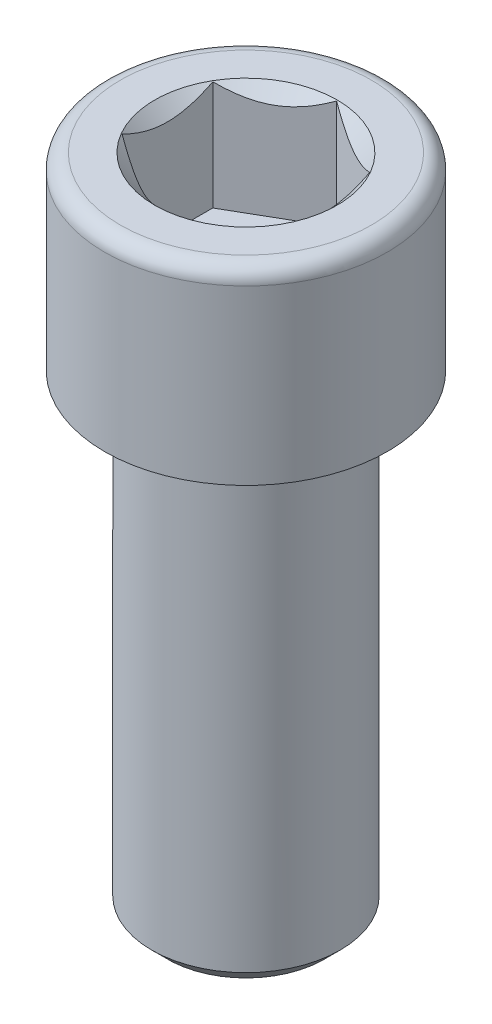
ISO-10303-21;
HEADER;
FILE_DESCRIPTION(('STEP AP214'),'2;1');
FILE_NAME('part.step','',(''),(''),'','','');
FILE_SCHEMA(('AUTOMOTIVE_DESIGN { 1 0 10303 214 1 1 1 1 }'));
ENDSEC;
DATA;
#1=APPLICATION_CONTEXT('core data for automotive mechanical design processes');
#2=APPLICATION_PROTOCOL_DEFINITION('international standard','automotive_design',2000,#1);
#3=PRODUCT_CONTEXT('',#1,'mechanical');
#4=PRODUCT('Part','Part','',(#3));
#5=PRODUCT_RELATED_PRODUCT_CATEGORY('part','',(#4));
#6=PRODUCT_DEFINITION_FORMATION('','',#4);
#7=PRODUCT_DEFINITION_CONTEXT('part definition',#1,'design');
#8=PRODUCT_DEFINITION('design','',#6,#7);
#9=PRODUCT_DEFINITION_SHAPE('','',#8);
#10=(LENGTH_UNIT() NAMED_UNIT(*) SI_UNIT(.MILLI.,.METRE.));
#11=(NAMED_UNIT(*) PLANE_ANGLE_UNIT() SI_UNIT($,.RADIAN.));
#12=(NAMED_UNIT(*) SI_UNIT($,.STERADIAN.) SOLID_ANGLE_UNIT());
#13=UNCERTAINTY_MEASURE_WITH_UNIT(LENGTH_MEASURE(1.E-05),#10,'distance_accuracy_value','');
#14=(GEOMETRIC_REPRESENTATION_CONTEXT(3) GLOBAL_UNCERTAINTY_ASSIGNED_CONTEXT((#13)) GLOBAL_UNIT_ASSIGNED_CONTEXT((#10,
#11,#12)) REPRESENTATION_CONTEXT('',''));
#15=CARTESIAN_POINT('',(0.,0.,0.));
#16=DIRECTION('',(0.,0.,1.));
#17=DIRECTION('',(1.,0.,0.));
#18=AXIS2_PLACEMENT_3D('',#15,#16,#17);
#19=CARTESIAN_POINT('',(0.,0.,0.));
#20=DIRECTION('',(0.,1.,0.));
#21=DIRECTION('',(0.,0.,1.));
#22=AXIS2_PLACEMENT_3D('',#19,#20,#21);
#23=PLANE('',#22);
#24=CARTESIAN_POINT('',(0.,0.,0.));
#25=DIRECTION('',(0.,1.,0.));
#26=DIRECTION('',(0.,0.,1.));
#27=AXIS2_PLACEMENT_3D('',#24,#25,#26);
#28=CIRCLE('',#27,9.);
#29=CARTESIAN_POINT('',(0.,0.,9.));
#30=VERTEX_POINT('',#29);
#31=EDGE_CURVE('E119',#30,#30,#28,.T.);
#32=ORIENTED_EDGE('',*,*,#31,.F.);
#33=EDGE_LOOP('',(#32));
#34=FACE_BOUND('',#33,.T.);
#35=CARTESIAN_POINT('',(0.,0.,0.));
#36=DIRECTION('',(0.,1.,0.));
#37=DIRECTION('',(0.,0.,1.));
#38=AXIS2_PLACEMENT_3D('',#35,#36,#37);
#39=CIRCLE('',#38,6.);
#40=CARTESIAN_POINT('',(0.,0.,6.));
#41=VERTEX_POINT('',#40);
#42=EDGE_CURVE('E96',#41,#41,#39,.F.);
#43=ORIENTED_EDGE('',*,*,#42,.F.);
#44=EDGE_LOOP('',(#43));
#45=FACE_BOUND('',#44,.T.);
#46=ADVANCED_FACE('F36',(#34,#45),#23,.F.);
#47=CARTESIAN_POINT('',(0.,12.,0.));
#48=DIRECTION('',(0.,-1.,0.));
#49=DIRECTION('',(0.,0.,-1.));
#50=AXIS2_PLACEMENT_3D('',#47,#48,#49);
#51=CYLINDRICAL_SURFACE('',#50,9.);
#52=CARTESIAN_POINT('',(0.,11.,0.));
#53=DIRECTION('',(0.,1.,0.));
#54=DIRECTION('',(0.,0.,1.));
#55=AXIS2_PLACEMENT_3D('',#52,#53,#54);
#56=CIRCLE('',#55,9.);
#57=CARTESIAN_POINT('',(0.,11.,9.));
#58=VERTEX_POINT('',#57);
#59=EDGE_CURVE('E213',#58,#58,#56,.F.);
#60=ORIENTED_EDGE('',*,*,#59,.T.);
#61=EDGE_LOOP('',(#60));
#62=FACE_BOUND('',#61,.T.);
#63=ORIENTED_EDGE('',*,*,#31,.T.);
#64=EDGE_LOOP('',(#63));
#65=FACE_BOUND('',#64,.T.);
#66=ADVANCED_FACE('F189',(#62,#65),#51,.T.);
#67=CARTESIAN_POINT('',(0.,12.,0.));
#68=DIRECTION('',(0.,1.,0.));
#69=DIRECTION('',(0.,0.,1.));
#70=AXIS2_PLACEMENT_3D('',#67,#68,#69);
#71=PLANE('',#70);
#72=CARTESIAN_POINT('',(0.,12.,0.));
#73=DIRECTION('',(0.,1.,0.));
#74=DIRECTION('',(0.,0.,1.));
#75=AXIS2_PLACEMENT_3D('',#72,#73,#74);
#76=CIRCLE('',#75,8.);
#77=CARTESIAN_POINT('',(0.,12.,8.));
#78=VERTEX_POINT('',#77);
#79=EDGE_CURVE('E95',#78,#78,#76,.T.);
#80=ORIENTED_EDGE('',*,*,#79,.T.);
#81=EDGE_LOOP('',(#80));
#82=FACE_BOUND('',#81,.T.);
#83=CARTESIAN_POINT('',(0.,12.,0.));
#84=DIRECTION('',(0.,1.,0.));
#85=DIRECTION('',(0.,0.,1.));
#86=AXIS2_PLACEMENT_3D('',#83,#84,#85);
#87=CIRCLE('',#86,5.81093826768622);
#88=CARTESIAN_POINT('',(0.,12.,5.81093826768622));
#89=VERTEX_POINT('',#88);
#90=EDGE_CURVE('E240',#89,#89,#87,.T.);
#91=ORIENTED_EDGE('',*,*,#90,.F.);
#92=EDGE_LOOP('',(#91));
#93=FACE_BOUND('',#92,.T.);
#94=ADVANCED_FACE('F195',(#82,#93),#71,.T.);
#95=CARTESIAN_POINT('',(0.,-30.,0.));
#96=DIRECTION('',(0.,1.,0.));
#97=DIRECTION('',(0.,0.,1.));
#98=AXIS2_PLACEMENT_3D('',#95,#96,#97);
#99=CYLINDRICAL_SURFACE('',#98,6.);
#100=CARTESIAN_POINT('',(0.,-29.,0.));
#101=DIRECTION('',(0.,-1.,0.));
#102=DIRECTION('',(0.,0.,-1.));
#103=AXIS2_PLACEMENT_3D('',#100,#101,#102);
#104=CIRCLE('',#103,6.);
#105=CARTESIAN_POINT('',(0.,-29.,-6.));
#106=VERTEX_POINT('',#105);
#107=EDGE_CURVE('E11',#106,#106,#104,.F.);
#108=ORIENTED_EDGE('',*,*,#107,.T.);
#109=EDGE_LOOP('',(#108));
#110=FACE_BOUND('',#109,.T.);
#111=ORIENTED_EDGE('',*,*,#42,.T.);
#112=EDGE_LOOP('',(#111));
#113=FACE_BOUND('',#112,.T.);
#114=ADVANCED_FACE('F222',(#110,#113),#99,.T.);
#115=CARTESIAN_POINT('',(0.,-30.,0.));
#116=DIRECTION('',(0.,-1.,0.));
#117=DIRECTION('',(0.,0.,-1.));
#118=AXIS2_PLACEMENT_3D('',#115,#116,#117);
#119=PLANE('',#118);
#120=CARTESIAN_POINT('',(0.,-30.,0.));
#121=DIRECTION('',(0.,-1.,0.));
#122=DIRECTION('',(0.,0.,-1.));
#123=AXIS2_PLACEMENT_3D('',#120,#121,#122);
#124=CIRCLE('',#123,5.00000000000001);
#125=CARTESIAN_POINT('',(0.,-30.,-5.00000000000001));
#126=VERTEX_POINT('',#125);
#127=EDGE_CURVE('E44',#126,#126,#124,.T.);
#128=ORIENTED_EDGE('',*,*,#127,.T.);
#129=EDGE_LOOP('',(#128));
#130=FACE_BOUND('',#129,.T.);
#131=ADVANCED_FACE('F137',(#130),#119,.T.);
#132=CARTESIAN_POINT('',(0.,12.,0.));
#133=DIRECTION('',(0.,1.,0.));
#134=DIRECTION('',(0.,0.,1.));
#135=AXIS2_PLACEMENT_3D('',#132,#133,#134);
#136=CONICAL_SURFACE('',#135,5.81093826768622,0.78539816339745);
#137=ORIENTED_EDGE('',*,*,#90,.T.);
#138=EDGE_LOOP('',(#137));
#139=FACE_BOUND('',#138,.T.);
#140=CARTESIAN_POINT('',(-5.,13.6735459873677,-5.56933609725159));
#141=CARTESIAN_POINT('',(-5.,13.5720062751828,-5.43284829289037));
#142=CARTESIAN_POINT('',(-5.,13.4715038218015,-5.29557573790338));
#143=CARTESIAN_POINT('',(-5.,13.2730308329659,-5.01915986463765));
#144=CARTESIAN_POINT('',(-5.,13.1750609676704,-4.88001606571339));
#145=CARTESIAN_POINT('',(-5.,12.9814162609444,-4.5985404049724));
#146=CARTESIAN_POINT('',(-5.,12.8857651110322,-4.45619218738107));
#147=CARTESIAN_POINT('',(-5.,12.6982202095897,-4.16904910555885));
#148=CARTESIAN_POINT('',(-5.,12.6063261867921,-4.02425441903543));
#149=CARTESIAN_POINT('',(-5.,12.4223827963738,-3.72412294935638));
#150=CARTESIAN_POINT('',(-5.,12.3305815857262,-3.56863329414973));
#151=CARTESIAN_POINT('',(-5.,12.1532831682675,-3.2540474229183));
#152=CARTESIAN_POINT('',(-5.,12.0677869151327,-3.09495066602882));
#153=CARTESIAN_POINT('',(-5.,11.9049594868381,-2.7732075830297));
#154=CARTESIAN_POINT('',(-5.,11.827604317355,-2.61057349583289));
#155=CARTESIAN_POINT('',(-5.,11.6827889239165,-2.28099377785123));
#156=CARTESIAN_POINT('',(-5.,11.6153243613848,-2.11405007553001));
#157=CARTESIAN_POINT('',(-5.,11.4967216695463,-1.78687354095023));
#158=CARTESIAN_POINT('',(-5.,11.4447982143086,-1.62692843526016));
#159=CARTESIAN_POINT('',(-5.,11.3538119719373,-1.30335201678948));
#160=CARTESIAN_POINT('',(-5.,11.3147501258052,-1.13972043522844));
#161=CARTESIAN_POINT('',(-5.,11.252126680705,-0.812381832184147));
#162=CARTESIAN_POINT('',(-5.,11.228310612085,-0.648724284210507));
#163=CARTESIAN_POINT('',(-5.,11.1966116840784,-0.319865809551682));
#164=CARTESIAN_POINT('',(-5.,11.1887264442598,-0.154665117154372));
#165=CARTESIAN_POINT('',(-5.,11.1894082426022,0.170501040217414));
#166=CARTESIAN_POINT('',(-5.,11.1974658316914,0.330467809448831));
#167=CARTESIAN_POINT('',(-5.,11.228504903709,0.648937510286319));
#168=CARTESIAN_POINT('',(-5.,11.2514878919689,0.80744029260343));
#169=CARTESIAN_POINT('',(-5.,11.311547619514,1.12451237335161));
#170=CARTESIAN_POINT('',(-5.,11.3488579389976,1.28303674358395));
#171=CARTESIAN_POINT('',(-5.,11.4356390062274,1.5966523073125));
#172=CARTESIAN_POINT('',(-5.,11.4851085171523,1.75174384824493));
#173=CARTESIAN_POINT('',(-5.,11.6009177619898,2.07702803904521));
#174=CARTESIAN_POINT('',(-5.,11.6685813784685,2.24674500328079));
#175=CARTESIAN_POINT('',(-5.,11.8142328926034,2.58172866069838));
#176=CARTESIAN_POINT('',(-5.,11.8922257319334,2.74699317792422));
#177=CARTESIAN_POINT('',(-5.,12.0566734416137,3.07390458090656));
#178=CARTESIAN_POINT('',(-5.,12.1431552916375,3.23553778540785));
#179=CARTESIAN_POINT('',(-5.,12.32266232216,3.55506968713754));
#180=CARTESIAN_POINT('',(-5.,12.4156864324563,3.71296898954796));
#181=CARTESIAN_POINT('',(-5.,12.6021790756088,4.01769192280839));
#182=CARTESIAN_POINT('',(-5.,12.6953907562144,4.16467358229614));
#183=CARTESIAN_POINT('',(-5.,12.88568737272,4.45611593315738));
#184=CARTESIAN_POINT('',(-5.,12.9827726042833,4.60057643087932));
#185=CARTESIAN_POINT('',(-5.,13.1793103316518,4.88612684786247));
#186=CARTESIAN_POINT('',(-5.,13.278736870396,5.02723469676174));
#187=CARTESIAN_POINT('',(-5.,13.4801846066551,5.30752952634856));
#188=CARTESIAN_POINT('',(-5.,13.582205085432,5.44671702299469));
#189=CARTESIAN_POINT('',(-5.,13.6852848709778,5.58510173091256));
#190=B_SPLINE_CURVE_WITH_KNOTS('',3,(#140,#141,#142,#143,#144,#145,#146,#147,#148,#149,#150,
#151,#152,#153,#154,#155,#156,#157,#158,#159,#160,#161,#162,#163,#164,#165,#166,#167,#168,#169,
#170,#171,#172,#173,#174,#175,#176,#177,#178,#179,#180,#181,#182,#183,#184,#185,#186,#187,#188,
#189),.UNSPECIFIED.,.F.,.F.,(4,2,2,2,2,2,2,2,2,2,2,2,2,2,2,2,2,2,2,2,2,2,2,2,4),(0.,
0.510356702690213,1.02084709854205,1.53529657463375,2.04970884125998,2.5912914126168,
3.13295573545577,3.67297604778849,4.2127587634893,4.71679505260157,5.22086821062576,
5.71629190826013,6.21164157272972,6.69141794654671,7.17124271670077,7.65924716374576,
8.14720199196661,8.69489352505693,9.24284803595354,9.79260420002447,10.3422706415897,
10.8643372128482,11.3864437093308,11.9042666274093,12.4219475961426),.UNSPECIFIED.);
#191=CARTESIAN_POINT('',(-5.,11.96256442421,-2.88675134594813));
#192=VERTEX_POINT('',#191);
#193=CARTESIAN_POINT('',(-5.,11.96256442421,2.88675134594813));
#194=VERTEX_POINT('',#193);
#195=EDGE_CURVE('E103',#192,#194,#190,.T.);
#196=ORIENTED_EDGE('',*,*,#195,.F.);
#197=CARTESIAN_POINT('',(0.000200000000000772,11.9626798977279,-5.7736181619501));
#198=CARTESIAN_POINT('',(-0.0857727681733065,11.9130479698143,-5.72398176110226));
#199=CARTESIAN_POINT('',(-0.172406369471808,11.8649391494969,-5.6739638280717));
#200=CARTESIAN_POINT('',(-0.347124889028838,11.7722310555398,-5.57309004377304));
#201=CARTESIAN_POINT('',(-0.435210568643609,11.7276336987115,-5.5222337529357));
#202=CARTESIAN_POINT('',(-0.702658569860329,11.5994234963383,-5.367822577439));
#203=CARTESIAN_POINT('',(-0.884284999421828,11.5219394897116,-5.26296050943972));
#204=CARTESIAN_POINT('',(-1.25054924277182,11.3892533686356,-5.05149774994706));
#205=CARTESIAN_POINT('',(-1.43509343762461,11.3337169648559,-4.94495110937143));
#206=CARTESIAN_POINT('',(-1.71494377217237,11.2694749182576,-4.78337944338747));
#207=CARTESIAN_POINT('',(-1.80863923991279,11.2512465875487,-4.72928433986569));
#208=CARTESIAN_POINT('',(-1.99682352572353,11.2215566113362,-4.6206360917956));
#209=CARTESIAN_POINT('',(-2.09131222308105,11.2100939545151,-4.56608301694086));
#210=CARTESIAN_POINT('',(-2.32156625980077,11.190875285956,-4.43314578685873));
#211=CARTESIAN_POINT('',(-2.45757968486242,11.1868427124698,-4.35461839928598));
#212=CARTESIAN_POINT('',(-2.72936141189439,11.1936102783153,-4.19770514602326));
#213=CARTESIAN_POINT('',(-2.86512961123582,11.204415617181,-4.11931933958609));
#214=CARTESIAN_POINT('',(-3.13538603207475,11.2402220741081,-3.96328672226451));
#215=CARTESIAN_POINT('',(-3.26987265077584,11.2652390681683,-3.88564083675503));
#216=CARTESIAN_POINT('',(-3.53653439939646,11.3281087491995,-3.73168360440634));
#217=CARTESIAN_POINT('',(-3.66870970573536,11.3659604519776,-3.65537215571135));
#218=CARTESIAN_POINT('',(-3.90334820652231,11.4438343109706,-3.51990355411976));
#219=CARTESIAN_POINT('',(-4.00633089069879,11.4818086746291,-3.4604464736886));
#220=CARTESIAN_POINT('',(-4.21044753419217,11.563877050384,-3.34259967462161));
#221=CARTESIAN_POINT('',(-4.31158143726392,11.6079712483136,-3.28420998845894));
#222=CARTESIAN_POINT('',(-4.51168198823797,11.7012908095624,-3.16868188148908));
#223=CARTESIAN_POINT('',(-4.61065432718709,11.7505000369194,-3.11154017495448));
#224=CARTESIAN_POINT('',(-4.80676624461304,11.853403547053,-2.99831490663731));
#225=CARTESIAN_POINT('',(-4.90390690306938,11.9070950787591,-2.94223072132829));
#226=CARTESIAN_POINT('',(-5.0002,11.9626798977279,-2.88663587589429));
#227=B_SPLINE_CURVE_WITH_KNOTS('',3,(#197,#198,#199,#200,#201,#202,#203,#204,#205,#206,#207,
#208,#209,#210,#211,#212,#213,#214,#215,#216,#217,#218,#219,#220,#221,#222,#223,#224,#225,#226),
.UNSPECIFIED.,.F.,.F.,(4,2,2,2,2,2,2,2,2,2,2,2,2,2,4),(0.,0.332945616209568,0.66607173610699,
1.33592065243334,1.99513262597481,2.32409207808824,2.6530023456369,3.12358963991983,
3.59434188052353,4.06562104077026,4.5368640704961,4.91117956742316,5.2855064331967,
5.65868635377115,6.03163889109472),.UNSPECIFIED.);
#228=CARTESIAN_POINT('',(0.,11.96256442421,-5.77350269189626));
#229=VERTEX_POINT('',#228);
#230=EDGE_CURVE('E157',#229,#192,#227,.T.);
#231=ORIENTED_EDGE('',*,*,#230,.F.);
#232=CARTESIAN_POINT('',(5.0002,11.9626798977279,-2.88663587589429));
#233=CARTESIAN_POINT('',(4.91422723182669,11.9130479698143,-2.93627227674213));
#234=CARTESIAN_POINT('',(4.82759363052819,11.8649391494969,-2.98629020977268));
#235=CARTESIAN_POINT('',(4.65287511097116,11.7722310555398,-3.08716399407135));
#236=CARTESIAN_POINT('',(4.56478943135639,11.7276336987115,-3.13802028490869));
#237=CARTESIAN_POINT('',(4.29734143013967,11.5994234963383,-3.29243146040539));
#238=CARTESIAN_POINT('',(4.11571500057817,11.5219394897116,-3.39729352840467));
#239=CARTESIAN_POINT('',(3.74945075722818,11.3892533686356,-3.60875628789732));
#240=CARTESIAN_POINT('',(3.56490656237539,11.3337169648559,-3.71530292847296));
#241=CARTESIAN_POINT('',(3.28505622782763,11.2694749182576,-3.87687459445692));
#242=CARTESIAN_POINT('',(3.19136076008721,11.2512465875487,-3.9309696979787));
#243=CARTESIAN_POINT('',(3.00317647427647,11.2215566113362,-4.03961794604879));
#244=CARTESIAN_POINT('',(2.90868777691895,11.2100939545151,-4.09417102090353));
#245=CARTESIAN_POINT('',(2.67843374019923,11.190875285956,-4.22710825098566));
#246=CARTESIAN_POINT('',(2.54242031513757,11.1868427124697,-4.30563563855841));
#247=CARTESIAN_POINT('',(2.27063858810561,11.1936102783153,-4.46254889182113));
#248=CARTESIAN_POINT('',(2.13487038876418,11.204415617181,-4.5409346982583));
#249=CARTESIAN_POINT('',(1.86461396792525,11.2402220741081,-4.69696731557988));
#250=CARTESIAN_POINT('',(1.73012734922416,11.2652390681683,-4.77461320108936));
#251=CARTESIAN_POINT('',(1.46346560060354,11.3281087491995,-4.92857043343805));
#252=CARTESIAN_POINT('',(1.33129029426463,11.3659604519776,-5.00488188213304));
#253=CARTESIAN_POINT('',(1.09665179347769,11.4438343109706,-5.14035048372463));
#254=CARTESIAN_POINT('',(0.993669109301207,11.4818086746291,-5.19980756415579));
#255=CARTESIAN_POINT('',(0.789552465807831,11.563877050384,-5.31765436322277));
#256=CARTESIAN_POINT('',(0.688418562736083,11.6079712483136,-5.37604404938545));
#257=CARTESIAN_POINT('',(0.488318011762028,11.7012908095624,-5.49157215635531));
#258=CARTESIAN_POINT('',(0.389345672812911,11.7505000369194,-5.54871386288991));
#259=CARTESIAN_POINT('',(0.193233755386958,11.853403547053,-5.66193913120707));
#260=CARTESIAN_POINT('',(0.0960930969306191,11.9070950787591,-5.7180233165161));
#261=CARTESIAN_POINT('',(-0.000199999999998475,11.9626798977279,-5.7736181619501));
#262=B_SPLINE_CURVE_WITH_KNOTS('',3,(#232,#233,#234,#235,#236,#237,#238,#239,#240,#241,#242,
#243,#244,#245,#246,#247,#248,#249,#250,#251,#252,#253,#254,#255,#256,#257,#258,#259,#260,#261),
.UNSPECIFIED.,.F.,.F.,(4,2,2,2,2,2,2,2,2,2,2,2,2,2,4),(0.,0.332945616209567,0.666071736106989,
1.33592065243334,1.99513262597481,2.32409207808824,2.65300234563691,3.12358963991983,
3.59434188052353,4.06562104077026,4.5368640704961,4.91117956742317,5.2855064331967,
5.65868635377115,6.03163889109472),.UNSPECIFIED.);
#263=CARTESIAN_POINT('',(5.,11.96256442421,-2.88675134594813));
#264=VERTEX_POINT('',#263);
#265=EDGE_CURVE('E151',#264,#229,#262,.T.);
#266=ORIENTED_EDGE('',*,*,#265,.F.);
#267=CARTESIAN_POINT('',(5.,13.6735459873677,-5.56933609725158));
#268=CARTESIAN_POINT('',(5.,13.5720062751828,-5.43284829289036));
#269=CARTESIAN_POINT('',(5.,13.4715038218014,-5.29557573790338));
#270=CARTESIAN_POINT('',(5.,13.2730308329659,-5.01915986463764));
#271=CARTESIAN_POINT('',(5.,13.1750609676704,-4.88001606571338));
#272=CARTESIAN_POINT('',(5.,12.9814162609444,-4.59854040497239));
#273=CARTESIAN_POINT('',(5.,12.8857651110322,-4.45619218738106));
#274=CARTESIAN_POINT('',(5.,12.6982202095897,-4.16904910555884));
#275=CARTESIAN_POINT('',(5.,12.6063261867921,-4.02425441903542));
#276=CARTESIAN_POINT('',(5.,12.4223827963738,-3.72412294935637));
#277=CARTESIAN_POINT('',(5.,12.3305815857262,-3.56863329414972));
#278=CARTESIAN_POINT('',(5.,12.1532831682675,-3.2540474229183));
#279=CARTESIAN_POINT('',(5.,12.0677869151327,-3.09495066602881));
#280=CARTESIAN_POINT('',(5.,11.9049594868381,-2.7732075830297));
#281=CARTESIAN_POINT('',(5.,11.827604317355,-2.61057349583288));
#282=CARTESIAN_POINT('',(5.,11.6827889239165,-2.28099377785122));
#283=CARTESIAN_POINT('',(5.,11.6153243613848,-2.11405007553001));
#284=CARTESIAN_POINT('',(5.,11.4967216695463,-1.78687354095023));
#285=CARTESIAN_POINT('',(5.,11.4447982143086,-1.62692843526015));
#286=CARTESIAN_POINT('',(5.,11.3538119719373,-1.30335201678947));
#287=CARTESIAN_POINT('',(5.,11.3147501258052,-1.13972043522843));
#288=CARTESIAN_POINT('',(5.,11.252126680705,-0.812381832184144));
#289=CARTESIAN_POINT('',(5.,11.228310612085,-0.648724284210504));
#290=CARTESIAN_POINT('',(5.,11.1966116840784,-0.319865809551679));
#291=CARTESIAN_POINT('',(5.,11.1887264442598,-0.15466511715437));
#292=CARTESIAN_POINT('',(5.,11.1894082426022,0.170501040217417));
#293=CARTESIAN_POINT('',(5.,11.1974658316914,0.330467809448834));
#294=CARTESIAN_POINT('',(5.,11.228504903709,0.648937510286322));
#295=CARTESIAN_POINT('',(5.,11.2514878919689,0.807440292603432));
#296=CARTESIAN_POINT('',(5.,11.311547619514,1.12451237335162));
#297=CARTESIAN_POINT('',(5.,11.3488579389976,1.28303674358395));
#298=CARTESIAN_POINT('',(5.,11.4356390062274,1.5966523073125));
#299=CARTESIAN_POINT('',(5.,11.4851085171523,1.75174384824493));
#300=CARTESIAN_POINT('',(5.,11.6009177619898,2.07702803904521));
#301=CARTESIAN_POINT('',(5.,11.6685813784685,2.24674500328079));
#302=CARTESIAN_POINT('',(5.,11.8142328926034,2.58172866069838));
#303=CARTESIAN_POINT('',(5.,11.8922257319334,2.74699317792422));
#304=CARTESIAN_POINT('',(5.,12.0566734416137,3.07390458090656));
#305=CARTESIAN_POINT('',(5.,12.1431552916375,3.23553778540785));
#306=CARTESIAN_POINT('',(5.,12.32266232216,3.55506968713755));
#307=CARTESIAN_POINT('',(5.,12.4156864324563,3.71296898954797));
#308=CARTESIAN_POINT('',(5.,12.6021790756088,4.01769192280839));
#309=CARTESIAN_POINT('',(5.,12.6953907562144,4.16467358229615));
#310=CARTESIAN_POINT('',(5.,12.88568737272,4.45611593315738));
#311=CARTESIAN_POINT('',(5.,12.9827726042834,4.60057643087933));
#312=CARTESIAN_POINT('',(5.,13.1793103316518,4.88612684786248));
#313=CARTESIAN_POINT('',(5.,13.278736870396,5.02723469676175));
#314=CARTESIAN_POINT('',(5.,13.4801846066551,5.30752952634857));
#315=CARTESIAN_POINT('',(5.,13.5822050854321,5.44671702299469));
#316=CARTESIAN_POINT('',(5.,13.6852848709778,5.58510173091257));
#317=B_SPLINE_CURVE_WITH_KNOTS('',3,(#267,#268,#269,#270,#271,#272,#273,#274,#275,#276,#277,
#278,#279,#280,#281,#282,#283,#284,#285,#286,#287,#288,#289,#290,#291,#292,#293,#294,#295,#296,
#297,#298,#299,#300,#301,#302,#303,#304,#305,#306,#307,#308,#309,#310,#311,#312,#313,#314,#315,
#316),.UNSPECIFIED.,.F.,.F.,(4,2,2,2,2,2,2,2,2,2,2,2,2,2,2,2,2,2,2,2,2,2,2,2,4),(0.,
0.51035670269021,1.02084709854204,1.53529657463375,2.04970884125997,2.59129141261679,
3.13295573545576,3.67297604778848,4.21275876348929,4.71679505260156,5.22086821062575,
5.71629190826012,6.21164157272971,6.6914179465467,7.17124271670076,7.65924716374575,
8.1472019919666,8.69489352505692,9.24284803595353,9.79260420002446,10.3422706415897,
10.8643372128482,11.3864437093308,11.9042666274093,12.4219475961426),.UNSPECIFIED.);
#318=CARTESIAN_POINT('',(5.,11.96256442421,2.88675134594813));
#319=VERTEX_POINT('',#318);
#320=EDGE_CURVE('E51',#319,#264,#317,.F.);
#321=ORIENTED_EDGE('',*,*,#320,.F.);
#322=CARTESIAN_POINT('',(-0.000199999999999063,11.9626798977279,5.7736181619501));
#323=CARTESIAN_POINT('',(0.085772768173308,11.9130479698143,5.72398176110226));
#324=CARTESIAN_POINT('',(0.17240636947181,11.8649391494969,5.67396382807171));
#325=CARTESIAN_POINT('',(0.347124889028841,11.7722310555398,5.57309004377304));
#326=CARTESIAN_POINT('',(0.435210568643611,11.7276336987115,5.5222337529357));
#327=CARTESIAN_POINT('',(0.702658569860331,11.5994234963383,5.367822577439));
#328=CARTESIAN_POINT('',(0.884284999421829,11.5219394897116,5.26296050943972));
#329=CARTESIAN_POINT('',(1.25054924277182,11.3892533686356,5.05149774994707));
#330=CARTESIAN_POINT('',(1.43509343762461,11.3337169648559,4.94495110937143));
#331=CARTESIAN_POINT('',(1.71494377217238,11.2694749182576,4.78337944338747));
#332=CARTESIAN_POINT('',(1.8086392399128,11.2512465875487,4.72928433986569));
#333=CARTESIAN_POINT('',(1.99682352572353,11.2215566113362,4.6206360917956));
#334=CARTESIAN_POINT('',(2.09131222308105,11.2100939545151,4.56608301694086));
#335=CARTESIAN_POINT('',(2.32156625980077,11.190875285956,4.43314578685873));
#336=CARTESIAN_POINT('',(2.45757968486243,11.1868427124698,4.35461839928598));
#337=CARTESIAN_POINT('',(2.72936141189439,11.1936102783153,4.19770514602326));
#338=CARTESIAN_POINT('',(2.86512961123582,11.204415617181,4.11931933958609));
#339=CARTESIAN_POINT('',(3.13538603207475,11.2402220741081,3.96328672226451));
#340=CARTESIAN_POINT('',(3.26987265077584,11.2652390681683,3.88564083675504));
#341=CARTESIAN_POINT('',(3.53653439939646,11.3281087491995,3.73168360440634));
#342=CARTESIAN_POINT('',(3.66870970573537,11.3659604519776,3.65537215571135));
#343=CARTESIAN_POINT('',(3.90334820652231,11.4438343109706,3.51990355411976));
#344=CARTESIAN_POINT('',(4.00633089069879,11.4818086746291,3.4604464736886));
#345=CARTESIAN_POINT('',(4.21044753419217,11.563877050384,3.34259967462162));
#346=CARTESIAN_POINT('',(4.31158143726392,11.6079712483136,3.28420998845895));
#347=CARTESIAN_POINT('',(4.51168198823797,11.7012908095624,3.16868188148908));
#348=CARTESIAN_POINT('',(4.61065432718709,11.7505000369194,3.11154017495448));
#349=CARTESIAN_POINT('',(4.80676624461304,11.853403547053,2.99831490663731));
#350=CARTESIAN_POINT('',(4.90390690306938,11.9070950787591,2.94223072132829));
#351=CARTESIAN_POINT('',(5.0002,11.9626798977279,2.8866358758943));
#352=B_SPLINE_CURVE_WITH_KNOTS('',3,(#322,#323,#324,#325,#326,#327,#328,#329,#330,#331,#332,
#333,#334,#335,#336,#337,#338,#339,#340,#341,#342,#343,#344,#345,#346,#347,#348,#349,#350,#351),
.UNSPECIFIED.,.F.,.F.,(4,2,2,2,2,2,2,2,2,2,2,2,2,2,4),(0.,0.332945616209568,0.666071736106991,
1.33592065243334,1.99513262597481,2.32409207808824,2.6530023456369,3.12358963991983,
3.59434188052353,4.06562104077026,4.5368640704961,4.91117956742316,5.28550643319669,
5.65868635377115,6.03163889109472),.UNSPECIFIED.);
#353=CARTESIAN_POINT('',(0.,11.96256442421,5.77350269189626));
#354=VERTEX_POINT('',#353);
#355=EDGE_CURVE('E88',#354,#319,#352,.T.);
#356=ORIENTED_EDGE('',*,*,#355,.F.);
#357=CARTESIAN_POINT('',(-5.0002,11.9626798977279,2.88663587589429));
#358=CARTESIAN_POINT('',(-4.91422723182669,11.9130479698143,2.93627227674213));
#359=CARTESIAN_POINT('',(-4.82759363052819,11.8649391494969,2.98629020977269));
#360=CARTESIAN_POINT('',(-4.65287511097116,11.7722310555398,3.08716399407135));
#361=CARTESIAN_POINT('',(-4.56478943135639,11.7276336987115,3.13802028490869));
#362=CARTESIAN_POINT('',(-4.29734143013967,11.5994234963383,3.29243146040539));
#363=CARTESIAN_POINT('',(-4.11571500057817,11.5219394897116,3.39729352840467));
#364=CARTESIAN_POINT('',(-3.74945075722818,11.3892533686356,3.60875628789733));
#365=CARTESIAN_POINT('',(-3.56490656237539,11.3337169648559,3.71530292847296));
#366=CARTESIAN_POINT('',(-3.28505622782762,11.2694749182576,3.87687459445692));
#367=CARTESIAN_POINT('',(-3.1913607600872,11.2512465875487,3.9309696979787));
#368=CARTESIAN_POINT('',(-3.00317647427647,11.2215566113362,4.03961794604879));
#369=CARTESIAN_POINT('',(-2.90868777691895,11.2100939545151,4.09417102090353));
#370=CARTESIAN_POINT('',(-2.67843374019922,11.190875285956,4.22710825098566));
#371=CARTESIAN_POINT('',(-2.54242031513757,11.1868427124698,4.30563563855841));
#372=CARTESIAN_POINT('',(-2.27063858810561,11.1936102783153,4.46254889182114));
#373=CARTESIAN_POINT('',(-2.13487038876418,11.204415617181,4.5409346982583));
#374=CARTESIAN_POINT('',(-1.86461396792525,11.2402220741081,4.69696731557988));
#375=CARTESIAN_POINT('',(-1.73012734922416,11.2652390681683,4.77461320108936));
#376=CARTESIAN_POINT('',(-1.46346560060354,11.3281087491995,4.92857043343805));
#377=CARTESIAN_POINT('',(-1.33129029426463,11.3659604519776,5.00488188213304));
#378=CARTESIAN_POINT('',(-1.09665179347769,11.4438343109706,5.14035048372463));
#379=CARTESIAN_POINT('',(-0.993669109301206,11.4818086746291,5.19980756415579));
#380=CARTESIAN_POINT('',(-0.78955246580783,11.563877050384,5.31765436322278));
#381=CARTESIAN_POINT('',(-0.688418562736081,11.6079712483136,5.37604404938545));
#382=CARTESIAN_POINT('',(-0.488318011762025,11.7012908095624,5.49157215635531));
#383=CARTESIAN_POINT('',(-0.38934567281291,11.7505000369194,5.54871386288991));
#384=CARTESIAN_POINT('',(-0.193233755386957,11.853403547053,5.66193913120708));
#385=CARTESIAN_POINT('',(-0.0960930969306178,11.9070950787591,5.7180233165161));
#386=CARTESIAN_POINT('',(0.000200000000000862,11.9626798977279,5.7736181619501));
#387=B_SPLINE_CURVE_WITH_KNOTS('',3,(#357,#358,#359,#360,#361,#362,#363,#364,#365,#366,#367,
#368,#369,#370,#371,#372,#373,#374,#375,#376,#377,#378,#379,#380,#381,#382,#383,#384,#385,#386),
.UNSPECIFIED.,.F.,.F.,(4,2,2,2,2,2,2,2,2,2,2,2,2,2,4),(0.,0.332945616209568,0.666071736106991,
1.33592065243334,1.99513262597481,2.32409207808824,2.6530023456369,3.12358963991983,
3.59434188052353,4.06562104077026,4.5368640704961,4.91117956742316,5.2855064331967,
5.65868635377115,6.03163889109472),.UNSPECIFIED.);
#388=EDGE_CURVE('E91',#194,#354,#387,.T.);
#389=ORIENTED_EDGE('',*,*,#388,.F.);
#390=EDGE_LOOP('',(#196,#231,#266,#321,#356,#389));
#391=FACE_BOUND('',#390,.T.);
#392=ADVANCED_FACE('F90',(#139,#391),#136,.F.);
#393=CARTESIAN_POINT('',(5.,5.,8.66025403784439));
#394=DIRECTION('',(0.,1.,0.));
#395=DIRECTION('',(0.,0.,1.));
#396=AXIS2_PLACEMENT_3D('',#393,#394,#395);
#397=PLANE('',#396);
#398=DIRECTION('',(0.866025403784439,0.,0.5));
#399=VECTOR('',#398,1.);
#400=CARTESIAN_POINT('',(-5.,5.,2.88675134594813));
#401=LINE('',#400,#399);
#402=CARTESIAN_POINT('',(-5.,5.,2.88675134594813));
#403=VERTEX_POINT('',#402);
#404=CARTESIAN_POINT('',(0.,5.,5.77350269189626));
#405=VERTEX_POINT('',#404);
#406=EDGE_CURVE('E102',#403,#405,#401,.T.);
#407=ORIENTED_EDGE('',*,*,#406,.T.);
#408=DIRECTION('',(0.866025403784439,0.,-0.5));
#409=VECTOR('',#408,1.);
#410=CARTESIAN_POINT('',(0.,5.,5.77350269189626));
#411=LINE('',#410,#409);
#412=CARTESIAN_POINT('',(5.,5.,2.88675134594813));
#413=VERTEX_POINT('',#412);
#414=EDGE_CURVE('E107',#405,#413,#411,.T.);
#415=ORIENTED_EDGE('',*,*,#414,.T.);
#416=DIRECTION('',(0.,0.,-1.));
#417=VECTOR('',#416,1.);
#418=CARTESIAN_POINT('',(5.,5.,2.88675134594813));
#419=LINE('',#418,#417);
#420=CARTESIAN_POINT('',(5.,5.,-2.88675134594813));
#421=VERTEX_POINT('',#420);
#422=EDGE_CURVE('E258',#413,#421,#419,.T.);
#423=ORIENTED_EDGE('',*,*,#422,.T.);
#424=DIRECTION('',(-0.866025403784439,0.,-0.5));
#425=VECTOR('',#424,1.);
#426=CARTESIAN_POINT('',(5.,5.,-2.88675134594813));
#427=LINE('',#426,#425);
#428=CARTESIAN_POINT('',(0.,5.,-5.77350269189626));
#429=VERTEX_POINT('',#428);
#430=EDGE_CURVE('E255',#421,#429,#427,.T.);
#431=ORIENTED_EDGE('',*,*,#430,.T.);
#432=DIRECTION('',(-0.866025403784439,0.,0.5));
#433=VECTOR('',#432,1.);
#434=CARTESIAN_POINT('',(0.,5.,-5.77350269189626));
#435=LINE('',#434,#433);
#436=CARTESIAN_POINT('',(-5.,5.,-2.88675134594813));
#437=VERTEX_POINT('',#436);
#438=EDGE_CURVE('E115',#429,#437,#435,.T.);
#439=ORIENTED_EDGE('',*,*,#438,.T.);
#440=DIRECTION('',(0.,0.,1.));
#441=VECTOR('',#440,1.);
#442=CARTESIAN_POINT('',(-5.,5.,-2.88675134594813));
#443=LINE('',#442,#441);
#444=EDGE_CURVE('E110',#437,#403,#443,.T.);
#445=ORIENTED_EDGE('',*,*,#444,.T.);
#446=EDGE_LOOP('',(#407,#415,#423,#431,#439,#445));
#447=FACE_BOUND('',#446,.T.);
#448=ADVANCED_FACE('F136',(#447),#397,.T.);
#449=CARTESIAN_POINT('',(0.,5.,5.77350269189626));
#450=DIRECTION('',(0.5,0.,0.866025403784439));
#451=DIRECTION('',(0.866025403784439,0.,-0.5));
#452=AXIS2_PLACEMENT_3D('',#449,#450,#451);
#453=PLANE('',#452);
#454=DIRECTION('',(0.,1.,0.));
#455=VECTOR('',#454,1.);
#456=CARTESIAN_POINT('',(0.,5.,5.77350269189626));
#457=LINE('',#456,#455);
#458=EDGE_CURVE('E100',#405,#354,#457,.T.);
#459=ORIENTED_EDGE('',*,*,#458,.T.);
#460=ORIENTED_EDGE('',*,*,#355,.T.);
#461=DIRECTION('',(0.,1.,0.));
#462=VECTOR('',#461,1.);
#463=CARTESIAN_POINT('',(5.,5.,2.88675134594813));
#464=LINE('',#463,#462);
#465=EDGE_CURVE('E109',#413,#319,#464,.T.);
#466=ORIENTED_EDGE('',*,*,#465,.F.);
#467=ORIENTED_EDGE('',*,*,#414,.F.);
#468=EDGE_LOOP('',(#459,#460,#466,#467));
#469=FACE_BOUND('',#468,.T.);
#470=ADVANCED_FACE('F105',(#469),#453,.F.);
#471=CARTESIAN_POINT('',(5.,5.,2.88675134594813));
#472=DIRECTION('',(1.,0.,0.));
#473=DIRECTION('',(0.,0.,-1.));
#474=AXIS2_PLACEMENT_3D('',#471,#472,#473);
#475=PLANE('',#474);
#476=ORIENTED_EDGE('',*,*,#465,.T.);
#477=ORIENTED_EDGE('',*,*,#320,.T.);
#478=DIRECTION('',(0.,1.,0.));
#479=VECTOR('',#478,1.);
#480=CARTESIAN_POINT('',(5.,5.,-2.88675134594813));
#481=LINE('',#480,#479);
#482=EDGE_CURVE('E112',#421,#264,#481,.T.);
#483=ORIENTED_EDGE('',*,*,#482,.F.);
#484=ORIENTED_EDGE('',*,*,#422,.F.);
#485=EDGE_LOOP('',(#476,#477,#483,#484));
#486=FACE_BOUND('',#485,.T.);
#487=ADVANCED_FACE('F180',(#486),#475,.F.);
#488=CARTESIAN_POINT('',(5.,5.,-2.88675134594813));
#489=DIRECTION('',(0.5,0.,-0.866025403784439));
#490=DIRECTION('',(-0.866025403784439,0.,-0.5));
#491=AXIS2_PLACEMENT_3D('',#488,#489,#490);
#492=PLANE('',#491);
#493=ORIENTED_EDGE('',*,*,#482,.T.);
#494=ORIENTED_EDGE('',*,*,#265,.T.);
#495=DIRECTION('',(0.,1.,0.));
#496=VECTOR('',#495,1.);
#497=CARTESIAN_POINT('',(0.,5.,-5.77350269189626));
#498=LINE('',#497,#496);
#499=EDGE_CURVE('E249',#429,#229,#498,.T.);
#500=ORIENTED_EDGE('',*,*,#499,.F.);
#501=ORIENTED_EDGE('',*,*,#430,.F.);
#502=EDGE_LOOP('',(#493,#494,#500,#501));
#503=FACE_BOUND('',#502,.T.);
#504=ADVANCED_FACE('F176',(#503),#492,.F.);
#505=CARTESIAN_POINT('',(0.,5.,-5.77350269189626));
#506=DIRECTION('',(-0.5,0.,-0.866025403784439));
#507=DIRECTION('',(-0.866025403784439,0.,0.5));
#508=AXIS2_PLACEMENT_3D('',#505,#506,#507);
#509=PLANE('',#508);
#510=ORIENTED_EDGE('',*,*,#499,.T.);
#511=ORIENTED_EDGE('',*,*,#230,.T.);
#512=DIRECTION('',(0.,1.,0.));
#513=VECTOR('',#512,1.);
#514=CARTESIAN_POINT('',(-5.,5.,-2.88675134594813));
#515=LINE('',#514,#513);
#516=EDGE_CURVE('E247',#437,#192,#515,.T.);
#517=ORIENTED_EDGE('',*,*,#516,.F.);
#518=ORIENTED_EDGE('',*,*,#438,.F.);
#519=EDGE_LOOP('',(#510,#511,#517,#518));
#520=FACE_BOUND('',#519,.T.);
#521=ADVANCED_FACE('F173',(#520),#509,.F.);
#522=CARTESIAN_POINT('',(-5.,5.,-2.88675134594813));
#523=DIRECTION('',(-1.,0.,0.));
#524=DIRECTION('',(0.,0.,1.));
#525=AXIS2_PLACEMENT_3D('',#522,#523,#524);
#526=PLANE('',#525);
#527=ORIENTED_EDGE('',*,*,#516,.T.);
#528=ORIENTED_EDGE('',*,*,#195,.T.);
#529=DIRECTION('',(0.,1.,0.));
#530=VECTOR('',#529,1.);
#531=CARTESIAN_POINT('',(-5.,5.,2.88675134594813));
#532=LINE('',#531,#530);
#533=EDGE_CURVE('E59',#403,#194,#532,.T.);
#534=ORIENTED_EDGE('',*,*,#533,.F.);
#535=ORIENTED_EDGE('',*,*,#444,.F.);
#536=EDGE_LOOP('',(#527,#528,#534,#535));
#537=FACE_BOUND('',#536,.T.);
#538=ADVANCED_FACE('F170',(#537),#526,.F.);
#539=CARTESIAN_POINT('',(-5.,5.,2.88675134594813));
#540=DIRECTION('',(-0.5,0.,0.866025403784439));
#541=DIRECTION('',(0.866025403784439,0.,0.5));
#542=AXIS2_PLACEMENT_3D('',#539,#540,#541);
#543=PLANE('',#542);
#544=ORIENTED_EDGE('',*,*,#533,.T.);
#545=ORIENTED_EDGE('',*,*,#388,.T.);
#546=ORIENTED_EDGE('',*,*,#458,.F.);
#547=ORIENTED_EDGE('',*,*,#406,.F.);
#548=EDGE_LOOP('',(#544,#545,#546,#547));
#549=FACE_BOUND('',#548,.T.);
#550=ADVANCED_FACE('F99',(#549),#543,.F.);
#551=CARTESIAN_POINT('',(0.,11.,0.));
#552=DIRECTION('',(0.,1.,0.));
#553=DIRECTION('',(0.,0.,1.));
#554=AXIS2_PLACEMENT_3D('',#551,#552,#553);
#555=TOROIDAL_SURFACE('',#554,8.,1.);
#556=ORIENTED_EDGE('',*,*,#59,.F.);
#557=EDGE_LOOP('',(#556));
#558=FACE_BOUND('',#557,.T.);
#559=ORIENTED_EDGE('',*,*,#79,.F.);
#560=EDGE_LOOP('',(#559));
#561=FACE_BOUND('',#560,.T.);
#562=ADVANCED_FACE('F202',(#558,#561),#555,.T.);
#563=CARTESIAN_POINT('',(0.,-30.,0.));
#564=DIRECTION('',(0.,1.,0.));
#565=DIRECTION('',(0.,0.,1.));
#566=AXIS2_PLACEMENT_3D('',#563,#564,#565);
#567=CONICAL_SURFACE('',#566,5.00000000000001,0.785398163397448);
#568=ORIENTED_EDGE('',*,*,#107,.F.);
#569=EDGE_LOOP('',(#568));
#570=FACE_BOUND('',#569,.T.);
#571=ORIENTED_EDGE('',*,*,#127,.F.);
#572=EDGE_LOOP('',(#571));
#573=FACE_BOUND('',#572,.T.);
#574=ADVANCED_FACE('F38',(#570,#573),#567,.T.);
#575=CLOSED_SHELL('',(#46,#66,#94,#114,#131,#392,#448,#470,#487,#504,#521,#538,#550,#562,#574));
#576=MANIFOLD_SOLID_BREP('B2',#575);
#577=ADVANCED_BREP_SHAPE_REPRESENTATION('',(#18,#576),#14);
#578=SHAPE_DEFINITION_REPRESENTATION(#9,#577);
ENDSEC;
END-ISO-10303-21;
